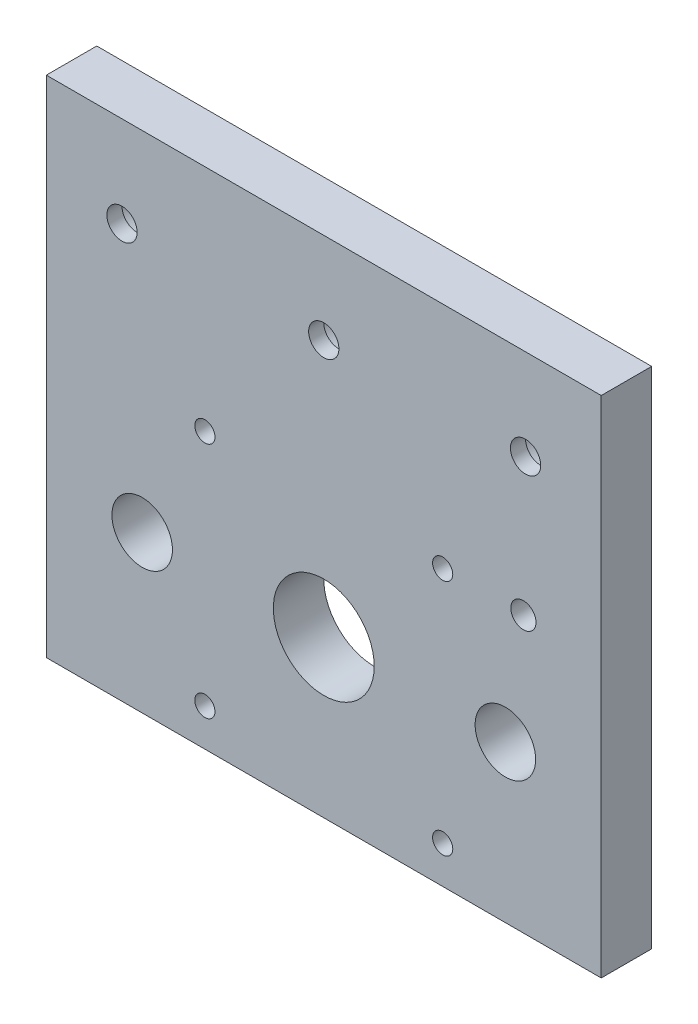
ISO-10303-21;
HEADER;
FILE_DESCRIPTION(('STEP AP214'),'2;1');
FILE_NAME('part.step','',(''),(''),'','','');
FILE_SCHEMA(('AUTOMOTIVE_DESIGN { 1 0 10303 214 1 1 1 1 }'));
ENDSEC;
DATA;
#1=APPLICATION_CONTEXT('core data for automotive mechanical design processes');
#2=APPLICATION_PROTOCOL_DEFINITION('international standard','automotive_design',2000,#1);
#3=PRODUCT_CONTEXT('',#1,'mechanical');
#4=PRODUCT('Part','Part','',(#3));
#5=PRODUCT_RELATED_PRODUCT_CATEGORY('part','',(#4));
#6=PRODUCT_DEFINITION_FORMATION('','',#4);
#7=PRODUCT_DEFINITION_CONTEXT('part definition',#1,'design');
#8=PRODUCT_DEFINITION('design','',#6,#7);
#9=PRODUCT_DEFINITION_SHAPE('','',#8);
#10=(LENGTH_UNIT() NAMED_UNIT(*) SI_UNIT(.MILLI.,.METRE.));
#11=(NAMED_UNIT(*) PLANE_ANGLE_UNIT() SI_UNIT($,.RADIAN.));
#12=(NAMED_UNIT(*) SI_UNIT($,.STERADIAN.) SOLID_ANGLE_UNIT());
#13=UNCERTAINTY_MEASURE_WITH_UNIT(LENGTH_MEASURE(1.E-05),#10,'distance_accuracy_value','');
#14=(GEOMETRIC_REPRESENTATION_CONTEXT(3) GLOBAL_UNCERTAINTY_ASSIGNED_CONTEXT((#13)) GLOBAL_UNIT_ASSIGNED_CONTEXT((#10,
#11,#12)) REPRESENTATION_CONTEXT('',''));
#15=CARTESIAN_POINT('',(0.,0.,0.));
#16=DIRECTION('',(0.,0.,1.));
#17=DIRECTION('',(1.,0.,0.));
#18=AXIS2_PLACEMENT_3D('',#15,#16,#17);
#19=CARTESIAN_POINT('',(0.,32.,9.99999999999976));
#20=DIRECTION('',(0.,0.,-1.));
#21=DIRECTION('',(-1.,0.,0.));
#22=AXIS2_PLACEMENT_3D('',#19,#20,#21);
#23=CYLINDRICAL_SURFACE('',#22,3.);
#24=CARTESIAN_POINT('',(0.,32.,9.99999999999976));
#25=DIRECTION('',(0.,0.,1.));
#26=DIRECTION('',(1.,0.,0.));
#27=AXIS2_PLACEMENT_3D('',#24,#25,#26);
#28=CIRCLE('',#27,3.);
#29=CARTESIAN_POINT('',(2.99999999999992,32.,9.99999999999975));
#30=VERTEX_POINT('',#29);
#31=EDGE_CURVE('E144',#30,#30,#28,.T.);
#32=ORIENTED_EDGE('',*,*,#31,.T.);
#33=EDGE_LOOP('',(#32));
#34=FACE_BOUND('',#33,.T.);
#35=CARTESIAN_POINT('',(0.,32.,6.99999999999976));
#36=DIRECTION('',(0.,0.,-1.));
#37=DIRECTION('',(-1.,0.,0.));
#38=AXIS2_PLACEMENT_3D('',#35,#36,#37);
#39=CIRCLE('',#38,3.);
#40=CARTESIAN_POINT('',(-3.00000000000006,32.,6.99999999999977));
#41=VERTEX_POINT('',#40);
#42=EDGE_CURVE('E21',#41,#41,#39,.T.);
#43=ORIENTED_EDGE('',*,*,#42,.T.);
#44=EDGE_LOOP('',(#43));
#45=FACE_BOUND('',#44,.T.);
#46=ADVANCED_FACE('F17',(#34,#45),#23,.F.);
#47=CARTESIAN_POINT('',(40.,32.,9.99999999999963));
#48=DIRECTION('',(0.,0.,-1.));
#49=DIRECTION('',(-1.,0.,0.));
#50=AXIS2_PLACEMENT_3D('',#47,#48,#49);
#51=CYLINDRICAL_SURFACE('',#50,3.);
#52=CARTESIAN_POINT('',(40.,32.,9.99999999999963));
#53=DIRECTION('',(0.,0.,1.));
#54=DIRECTION('',(1.,0.,0.));
#55=AXIS2_PLACEMENT_3D('',#52,#53,#54);
#56=CIRCLE('',#55,3.);
#57=CARTESIAN_POINT('',(43.,32.,9.99999999999962));
#58=VERTEX_POINT('',#57);
#59=EDGE_CURVE('E141',#58,#58,#56,.T.);
#60=ORIENTED_EDGE('',*,*,#59,.T.);
#61=EDGE_LOOP('',(#60));
#62=FACE_BOUND('',#61,.T.);
#63=CARTESIAN_POINT('',(40.,32.,6.99999999999963));
#64=DIRECTION('',(0.,0.,-1.));
#65=DIRECTION('',(-1.,0.,0.));
#66=AXIS2_PLACEMENT_3D('',#63,#64,#65);
#67=CIRCLE('',#66,3.);
#68=CARTESIAN_POINT('',(37.,32.,6.99999999999964));
#69=VERTEX_POINT('',#68);
#70=EDGE_CURVE('E96',#69,#69,#67,.T.);
#71=ORIENTED_EDGE('',*,*,#70,.T.);
#72=EDGE_LOOP('',(#71));
#73=FACE_BOUND('',#72,.T.);
#74=ADVANCED_FACE('F186',(#62,#73),#51,.F.);
#75=CARTESIAN_POINT('',(-40.,32.,9.99999999999977));
#76=DIRECTION('',(0.,0.,-1.));
#77=DIRECTION('',(-1.,0.,0.));
#78=AXIS2_PLACEMENT_3D('',#75,#76,#77);
#79=CYLINDRICAL_SURFACE('',#78,3.);
#80=CARTESIAN_POINT('',(-40.,32.,9.99999999999977));
#81=DIRECTION('',(0.,0.,1.));
#82=DIRECTION('',(1.,0.,0.));
#83=AXIS2_PLACEMENT_3D('',#80,#81,#82);
#84=CIRCLE('',#83,3.);
#85=CARTESIAN_POINT('',(-37.,32.,9.99999999999976));
#86=VERTEX_POINT('',#85);
#87=EDGE_CURVE('E136',#86,#86,#84,.T.);
#88=ORIENTED_EDGE('',*,*,#87,.T.);
#89=EDGE_LOOP('',(#88));
#90=FACE_BOUND('',#89,.T.);
#91=CARTESIAN_POINT('',(-40.,32.,6.99999999999977));
#92=DIRECTION('',(0.,0.,-1.));
#93=DIRECTION('',(-1.,0.,0.));
#94=AXIS2_PLACEMENT_3D('',#91,#92,#93);
#95=CIRCLE('',#94,3.);
#96=CARTESIAN_POINT('',(-43.,32.,6.99999999999978));
#97=VERTEX_POINT('',#96);
#98=EDGE_CURVE('E94',#97,#97,#95,.T.);
#99=ORIENTED_EDGE('',*,*,#98,.T.);
#100=EDGE_LOOP('',(#99));
#101=FACE_BOUND('',#100,.T.);
#102=ADVANCED_FACE('F193',(#90,#101),#79,.F.);
#103=CARTESIAN_POINT('',(0.,0.,9.99999999999976));
#104=DIRECTION('',(0.,0.,-1.));
#105=DIRECTION('',(-1.,0.,0.));
#106=AXIS2_PLACEMENT_3D('',#103,#104,#105);
#107=PLANE('',#106);
#108=DIRECTION('',(0.,-1.,0.));
#109=VECTOR('',#108,1.);
#110=CARTESIAN_POINT('',(-55.,50.,9.99999999999977));
#111=LINE('',#110,#109);
#112=CARTESIAN_POINT('',(-55.,50.,9.99999999999977));
#113=VERTEX_POINT('',#112);
#114=CARTESIAN_POINT('',(-55.,-50.,10.0000000000002));
#115=VERTEX_POINT('',#114);
#116=EDGE_CURVE('E72',#113,#115,#111,.T.);
#117=ORIENTED_EDGE('',*,*,#116,.T.);
#118=DIRECTION('',(1.,0.,0.));
#119=VECTOR('',#118,1.);
#120=CARTESIAN_POINT('',(55.,-50.,10.));
#121=LINE('',#120,#119);
#122=CARTESIAN_POINT('',(55.,-50.,10.));
#123=VERTEX_POINT('',#122);
#124=EDGE_CURVE('E66',#115,#123,#121,.T.);
#125=ORIENTED_EDGE('',*,*,#124,.T.);
#126=DIRECTION('',(0.,1.,0.));
#127=VECTOR('',#126,1.);
#128=CARTESIAN_POINT('',(55.,50.,9.99999999999961));
#129=LINE('',#128,#127);
#130=CARTESIAN_POINT('',(55.,50.,9.99999999999961));
#131=VERTEX_POINT('',#130);
#132=EDGE_CURVE('E70',#123,#131,#129,.T.);
#133=ORIENTED_EDGE('',*,*,#132,.T.);
#134=DIRECTION('',(-1.,0.,0.));
#135=VECTOR('',#134,1.);
#136=CARTESIAN_POINT('',(55.,50.,9.99999999999961));
#137=LINE('',#136,#135);
#138=EDGE_CURVE('E36',#131,#113,#137,.T.);
#139=ORIENTED_EDGE('',*,*,#138,.T.);
#140=EDGE_LOOP('',(#117,#125,#133,#139));
#141=FACE_BOUND('',#140,.T.);
#142=CARTESIAN_POINT('',(36.,-19.,10.));
#143=DIRECTION('',(0.,0.,1.));
#144=DIRECTION('',(1.,0.,0.));
#145=AXIS2_PLACEMENT_3D('',#142,#143,#144);
#146=CIRCLE('',#145,6.);
#147=CARTESIAN_POINT('',(42.,-19.,9.99999999999999));
#148=VERTEX_POINT('',#147);
#149=EDGE_CURVE('E88',#148,#148,#146,.T.);
#150=ORIENTED_EDGE('',*,*,#149,.F.);
#151=EDGE_LOOP('',(#150));
#152=FACE_BOUND('',#151,.T.);
#153=CARTESIAN_POINT('',(0.,-19.,9.99999999999976));
#154=DIRECTION('',(0.,0.,1.));
#155=DIRECTION('',(1.,0.,0.));
#156=AXIS2_PLACEMENT_3D('',#153,#154,#155);
#157=CIRCLE('',#156,10.);
#158=CARTESIAN_POINT('',(10.,-19.,9.99999999999974));
#159=VERTEX_POINT('',#158);
#160=EDGE_CURVE('E154',#159,#159,#157,.T.);
#161=ORIENTED_EDGE('',*,*,#160,.F.);
#162=EDGE_LOOP('',(#161));
#163=FACE_BOUND('',#162,.T.);
#164=CARTESIAN_POINT('',(-36.,-19.,9.99999999999977));
#165=DIRECTION('',(0.,0.,1.));
#166=DIRECTION('',(1.,0.,0.));
#167=AXIS2_PLACEMENT_3D('',#164,#165,#166);
#168=CIRCLE('',#167,6.);
#169=CARTESIAN_POINT('',(-30.,-19.,9.99999999999976));
#170=VERTEX_POINT('',#169);
#171=EDGE_CURVE('E148',#170,#170,#168,.T.);
#172=ORIENTED_EDGE('',*,*,#171,.F.);
#173=EDGE_LOOP('',(#172));
#174=FACE_BOUND('',#173,.T.);
#175=ORIENTED_EDGE('',*,*,#31,.F.);
#176=EDGE_LOOP('',(#175));
#177=FACE_BOUND('',#176,.T.);
#178=ORIENTED_EDGE('',*,*,#59,.F.);
#179=EDGE_LOOP('',(#178));
#180=FACE_BOUND('',#179,.T.);
#181=ORIENTED_EDGE('',*,*,#87,.F.);
#182=EDGE_LOOP('',(#181));
#183=FACE_BOUND('',#182,.T.);
#184=CARTESIAN_POINT('',(23.57,4.57,10.));
#185=DIRECTION('',(0.,0.,1.));
#186=DIRECTION('',(1.,0.,0.));
#187=AXIS2_PLACEMENT_3D('',#184,#185,#186);
#188=CIRCLE('',#187,2.);
#189=CARTESIAN_POINT('',(25.57,4.57,10.));
#190=VERTEX_POINT('',#189);
#191=EDGE_CURVE('E133',#190,#190,#188,.T.);
#192=ORIENTED_EDGE('',*,*,#191,.F.);
#193=EDGE_LOOP('',(#192));
#194=FACE_BOUND('',#193,.T.);
#195=CARTESIAN_POINT('',(-23.57,4.57,9.99999999999977));
#196=DIRECTION('',(0.,0.,1.));
#197=DIRECTION('',(1.,0.,0.));
#198=AXIS2_PLACEMENT_3D('',#195,#196,#197);
#199=CIRCLE('',#198,2.);
#200=CARTESIAN_POINT('',(-21.57,4.57,9.99999999999977));
#201=VERTEX_POINT('',#200);
#202=EDGE_CURVE('E127',#201,#201,#199,.T.);
#203=ORIENTED_EDGE('',*,*,#202,.F.);
#204=EDGE_LOOP('',(#203));
#205=FACE_BOUND('',#204,.T.);
#206=CARTESIAN_POINT('',(-23.57,-42.57,9.99999999999977));
#207=DIRECTION('',(0.,0.,1.));
#208=DIRECTION('',(1.,0.,0.));
#209=AXIS2_PLACEMENT_3D('',#206,#207,#208);
#210=CIRCLE('',#209,2.);
#211=CARTESIAN_POINT('',(-21.57,-42.57,9.99999999999977));
#212=VERTEX_POINT('',#211);
#213=EDGE_CURVE('E121',#212,#212,#210,.T.);
#214=ORIENTED_EDGE('',*,*,#213,.F.);
#215=EDGE_LOOP('',(#214));
#216=FACE_BOUND('',#215,.T.);
#217=CARTESIAN_POINT('',(23.57,-42.57,10.));
#218=DIRECTION('',(0.,0.,1.));
#219=DIRECTION('',(1.,0.,0.));
#220=AXIS2_PLACEMENT_3D('',#217,#218,#219);
#221=CIRCLE('',#220,2.);
#222=CARTESIAN_POINT('',(25.57,-42.57,10.));
#223=VERTEX_POINT('',#222);
#224=EDGE_CURVE('E115',#223,#223,#221,.T.);
#225=ORIENTED_EDGE('',*,*,#224,.F.);
#226=EDGE_LOOP('',(#225));
#227=FACE_BOUND('',#226,.T.);
#228=CARTESIAN_POINT('',(39.57,4.57,10.));
#229=DIRECTION('',(0.,0.,1.));
#230=DIRECTION('',(1.,0.,0.));
#231=AXIS2_PLACEMENT_3D('',#228,#229,#230);
#232=CIRCLE('',#231,2.5);
#233=CARTESIAN_POINT('',(42.07,4.57,9.99999999999999));
#234=VERTEX_POINT('',#233);
#235=EDGE_CURVE('E106',#234,#234,#232,.T.);
#236=ORIENTED_EDGE('',*,*,#235,.F.);
#237=EDGE_LOOP('',(#236));
#238=FACE_BOUND('',#237,.T.);
#239=ADVANCED_FACE('F67',(#141,#152,#163,#174,#177,#180,#183,#194,#205,#216,#227,#238),#107,.F.);
#240=CARTESIAN_POINT('',(0.,0.,0.));
#241=DIRECTION('',(0.,0.,-1.));
#242=DIRECTION('',(-1.,0.,0.));
#243=AXIS2_PLACEMENT_3D('',#240,#241,#242);
#244=PLANE('',#243);
#245=CARTESIAN_POINT('',(40.,32.,0.));
#246=DIRECTION('',(0.,0.,-1.));
#247=DIRECTION('',(-1.,0.,0.));
#248=AXIS2_PLACEMENT_3D('',#245,#246,#247);
#249=CIRCLE('',#248,5.5);
#250=CARTESIAN_POINT('',(34.5,32.,0.));
#251=VERTEX_POINT('',#250);
#252=EDGE_CURVE('E265',#251,#251,#249,.T.);
#253=ORIENTED_EDGE('',*,*,#252,.F.);
#254=EDGE_LOOP('',(#253));
#255=FACE_BOUND('',#254,.T.);
#256=CARTESIAN_POINT('',(0.,32.,0.));
#257=DIRECTION('',(0.,0.,-1.));
#258=DIRECTION('',(-1.,0.,0.));
#259=AXIS2_PLACEMENT_3D('',#256,#257,#258);
#260=CIRCLE('',#259,5.5);
#261=CARTESIAN_POINT('',(-5.50000000000006,32.,0.));
#262=VERTEX_POINT('',#261);
#263=EDGE_CURVE('E255',#262,#262,#260,.T.);
#264=ORIENTED_EDGE('',*,*,#263,.F.);
#265=EDGE_LOOP('',(#264));
#266=FACE_BOUND('',#265,.T.);
#267=CARTESIAN_POINT('',(-40.,32.,0.));
#268=DIRECTION('',(0.,0.,-1.));
#269=DIRECTION('',(-1.,0.,0.));
#270=AXIS2_PLACEMENT_3D('',#267,#268,#269);
#271=CIRCLE('',#270,5.5);
#272=CARTESIAN_POINT('',(-45.5,32.,0.));
#273=VERTEX_POINT('',#272);
#274=EDGE_CURVE('E256',#273,#273,#271,.T.);
#275=ORIENTED_EDGE('',*,*,#274,.F.);
#276=EDGE_LOOP('',(#275));
#277=FACE_BOUND('',#276,.T.);
#278=CARTESIAN_POINT('',(23.57,-42.57,0.));
#279=DIRECTION('',(0.,0.,1.));
#280=DIRECTION('',(1.,0.,0.));
#281=AXIS2_PLACEMENT_3D('',#278,#279,#280);
#282=CIRCLE('',#281,2.);
#283=CARTESIAN_POINT('',(25.57,-42.57,0.));
#284=VERTEX_POINT('',#283);
#285=EDGE_CURVE('E111',#284,#284,#282,.T.);
#286=ORIENTED_EDGE('',*,*,#285,.T.);
#287=EDGE_LOOP('',(#286));
#288=FACE_BOUND('',#287,.T.);
#289=CARTESIAN_POINT('',(-23.57,4.5700000000003,0.));
#290=DIRECTION('',(0.,0.,1.));
#291=DIRECTION('',(1.,0.,0.));
#292=AXIS2_PLACEMENT_3D('',#289,#290,#291);
#293=CIRCLE('',#292,2.);
#294=CARTESIAN_POINT('',(-21.57,4.5700000000003,0.));
#295=VERTEX_POINT('',#294);
#296=EDGE_CURVE('E124',#295,#295,#293,.T.);
#297=ORIENTED_EDGE('',*,*,#296,.T.);
#298=EDGE_LOOP('',(#297));
#299=FACE_BOUND('',#298,.T.);
#300=CARTESIAN_POINT('',(0.,-19.,0.));
#301=DIRECTION('',(0.,0.,1.));
#302=DIRECTION('',(1.,0.,0.));
#303=AXIS2_PLACEMENT_3D('',#300,#301,#302);
#304=CIRCLE('',#303,10.);
#305=CARTESIAN_POINT('',(10.,-19.,0.));
#306=VERTEX_POINT('',#305);
#307=EDGE_CURVE('E151',#306,#306,#304,.T.);
#308=ORIENTED_EDGE('',*,*,#307,.T.);
#309=EDGE_LOOP('',(#308));
#310=FACE_BOUND('',#309,.T.);
#311=DIRECTION('',(0.,-1.,0.));
#312=VECTOR('',#311,1.);
#313=CARTESIAN_POINT('',(-55.,50.,0.));
#314=LINE('',#313,#312);
#315=CARTESIAN_POINT('',(-55.,50.,0.));
#316=VERTEX_POINT('',#315);
#317=CARTESIAN_POINT('',(-55.,-50.,0.));
#318=VERTEX_POINT('',#317);
#319=EDGE_CURVE('E85',#316,#318,#314,.T.);
#320=ORIENTED_EDGE('',*,*,#319,.F.);
#321=DIRECTION('',(-1.,0.,0.));
#322=VECTOR('',#321,1.);
#323=CARTESIAN_POINT('',(55.,50.,0.));
#324=LINE('',#323,#322);
#325=CARTESIAN_POINT('',(55.,50.,0.));
#326=VERTEX_POINT('',#325);
#327=EDGE_CURVE('E59',#326,#316,#324,.T.);
#328=ORIENTED_EDGE('',*,*,#327,.F.);
#329=DIRECTION('',(0.,1.,0.));
#330=VECTOR('',#329,1.);
#331=CARTESIAN_POINT('',(55.,50.,0.));
#332=LINE('',#331,#330);
#333=CARTESIAN_POINT('',(55.,-50.,0.));
#334=VERTEX_POINT('',#333);
#335=EDGE_CURVE('E53',#334,#326,#332,.T.);
#336=ORIENTED_EDGE('',*,*,#335,.F.);
#337=DIRECTION('',(1.,0.,0.));
#338=VECTOR('',#337,1.);
#339=CARTESIAN_POINT('',(55.,-50.,0.));
#340=LINE('',#339,#338);
#341=EDGE_CURVE('E76',#318,#334,#340,.T.);
#342=ORIENTED_EDGE('',*,*,#341,.F.);
#343=EDGE_LOOP('',(#320,#328,#336,#342));
#344=FACE_BOUND('',#343,.T.);
#345=CARTESIAN_POINT('',(36.,-19.,0.));
#346=DIRECTION('',(0.,0.,1.));
#347=DIRECTION('',(1.,0.,0.));
#348=AXIS2_PLACEMENT_3D('',#345,#346,#347);
#349=CIRCLE('',#348,6.);
#350=CARTESIAN_POINT('',(42.,-19.,0.));
#351=VERTEX_POINT('',#350);
#352=EDGE_CURVE('E157',#351,#351,#349,.T.);
#353=ORIENTED_EDGE('',*,*,#352,.T.);
#354=EDGE_LOOP('',(#353));
#355=FACE_BOUND('',#354,.T.);
#356=CARTESIAN_POINT('',(-36.,-19.,0.));
#357=DIRECTION('',(0.,0.,1.));
#358=DIRECTION('',(1.,0.,0.));
#359=AXIS2_PLACEMENT_3D('',#356,#357,#358);
#360=CIRCLE('',#359,6.);
#361=CARTESIAN_POINT('',(-30.,-19.,0.));
#362=VERTEX_POINT('',#361);
#363=EDGE_CURVE('E147',#362,#362,#360,.T.);
#364=ORIENTED_EDGE('',*,*,#363,.T.);
#365=EDGE_LOOP('',(#364));
#366=FACE_BOUND('',#365,.T.);
#367=CARTESIAN_POINT('',(23.57,4.57,0.));
#368=DIRECTION('',(0.,0.,1.));
#369=DIRECTION('',(1.,0.,0.));
#370=AXIS2_PLACEMENT_3D('',#367,#368,#369);
#371=CIRCLE('',#370,2.);
#372=CARTESIAN_POINT('',(25.57,4.57,0.));
#373=VERTEX_POINT('',#372);
#374=EDGE_CURVE('E130',#373,#373,#371,.T.);
#375=ORIENTED_EDGE('',*,*,#374,.T.);
#376=EDGE_LOOP('',(#375));
#377=FACE_BOUND('',#376,.T.);
#378=CARTESIAN_POINT('',(-23.57,-42.57,0.));
#379=DIRECTION('',(0.,0.,1.));
#380=DIRECTION('',(1.,0.,0.));
#381=AXIS2_PLACEMENT_3D('',#378,#379,#380);
#382=CIRCLE('',#381,2.);
#383=CARTESIAN_POINT('',(-21.57,-42.57,0.));
#384=VERTEX_POINT('',#383);
#385=EDGE_CURVE('E118',#384,#384,#382,.T.);
#386=ORIENTED_EDGE('',*,*,#385,.T.);
#387=EDGE_LOOP('',(#386));
#388=FACE_BOUND('',#387,.T.);
#389=CARTESIAN_POINT('',(39.57,4.57,0.));
#390=DIRECTION('',(0.,0.,1.));
#391=DIRECTION('',(1.,0.,0.));
#392=AXIS2_PLACEMENT_3D('',#389,#390,#391);
#393=CIRCLE('',#392,2.5);
#394=CARTESIAN_POINT('',(42.07,4.57,0.));
#395=VERTEX_POINT('',#394);
#396=EDGE_CURVE('E102',#395,#395,#393,.T.);
#397=ORIENTED_EDGE('',*,*,#396,.T.);
#398=EDGE_LOOP('',(#397));
#399=FACE_BOUND('',#398,.T.);
#400=ADVANCED_FACE('F165',(#255,#266,#277,#288,#299,#310,#344,#355,#366,#377,#388,#399),#244,.T.);
#401=CARTESIAN_POINT('',(-55.,50.,9.99999999999977));
#402=DIRECTION('',(1.,0.,0.));
#403=DIRECTION('',(0.,1.,0.));
#404=AXIS2_PLACEMENT_3D('',#401,#402,#403);
#405=PLANE('',#404);
#406=ORIENTED_EDGE('',*,*,#319,.T.);
#407=DIRECTION('',(0.,0.,-1.));
#408=VECTOR('',#407,1.);
#409=CARTESIAN_POINT('',(-55.,-50.,10.0000000000002));
#410=LINE('',#409,#408);
#411=EDGE_CURVE('E11',#115,#318,#410,.T.);
#412=ORIENTED_EDGE('',*,*,#411,.F.);
#413=ORIENTED_EDGE('',*,*,#116,.F.);
#414=DIRECTION('',(0.,0.,-1.));
#415=VECTOR('',#414,1.);
#416=CARTESIAN_POINT('',(-55.,50.,9.99999999999977));
#417=LINE('',#416,#415);
#418=EDGE_CURVE('E81',#113,#316,#417,.T.);
#419=ORIENTED_EDGE('',*,*,#418,.T.);
#420=EDGE_LOOP('',(#406,#412,#413,#419));
#421=FACE_BOUND('',#420,.T.);
#422=ADVANCED_FACE('F19',(#421),#405,.F.);
#423=CARTESIAN_POINT('',(55.,-50.,10.));
#424=DIRECTION('',(0.,1.,0.));
#425=DIRECTION('',(-1.,0.,0.));
#426=AXIS2_PLACEMENT_3D('',#423,#424,#425);
#427=PLANE('',#426);
#428=ORIENTED_EDGE('',*,*,#341,.T.);
#429=DIRECTION('',(0.,0.,-1.));
#430=VECTOR('',#429,1.);
#431=CARTESIAN_POINT('',(55.,-50.,10.));
#432=LINE('',#431,#430);
#433=EDGE_CURVE('E27',#123,#334,#432,.T.);
#434=ORIENTED_EDGE('',*,*,#433,.F.);
#435=ORIENTED_EDGE('',*,*,#124,.F.);
#436=ORIENTED_EDGE('',*,*,#411,.T.);
#437=EDGE_LOOP('',(#428,#434,#435,#436));
#438=FACE_BOUND('',#437,.T.);
#439=ADVANCED_FACE('F75',(#438),#427,.F.);
#440=CARTESIAN_POINT('',(55.,50.,9.99999999999961));
#441=DIRECTION('',(-1.,0.,0.));
#442=DIRECTION('',(0.,-1.,0.));
#443=AXIS2_PLACEMENT_3D('',#440,#441,#442);
#444=PLANE('',#443);
#445=ORIENTED_EDGE('',*,*,#335,.T.);
#446=DIRECTION('',(0.,0.,-1.));
#447=VECTOR('',#446,1.);
#448=CARTESIAN_POINT('',(55.,50.,9.99999999999961));
#449=LINE('',#448,#447);
#450=EDGE_CURVE('E77',#131,#326,#449,.T.);
#451=ORIENTED_EDGE('',*,*,#450,.F.);
#452=ORIENTED_EDGE('',*,*,#132,.F.);
#453=ORIENTED_EDGE('',*,*,#433,.T.);
#454=EDGE_LOOP('',(#445,#451,#452,#453));
#455=FACE_BOUND('',#454,.T.);
#456=ADVANCED_FACE('F79',(#455),#444,.F.);
#457=CARTESIAN_POINT('',(55.,50.,9.99999999999961));
#458=DIRECTION('',(0.,-1.,0.));
#459=DIRECTION('',(1.,0.,0.));
#460=AXIS2_PLACEMENT_3D('',#457,#458,#459);
#461=PLANE('',#460);
#462=ORIENTED_EDGE('',*,*,#327,.T.);
#463=ORIENTED_EDGE('',*,*,#418,.F.);
#464=ORIENTED_EDGE('',*,*,#138,.F.);
#465=ORIENTED_EDGE('',*,*,#450,.T.);
#466=EDGE_LOOP('',(#462,#463,#464,#465));
#467=FACE_BOUND('',#466,.T.);
#468=ADVANCED_FACE('F171',(#467),#461,.F.);
#469=CARTESIAN_POINT('',(36.,-19.,10.));
#470=DIRECTION('',(0.,0.,-1.));
#471=DIRECTION('',(-1.,0.,0.));
#472=AXIS2_PLACEMENT_3D('',#469,#470,#471);
#473=CYLINDRICAL_SURFACE('',#472,6.);
#474=ORIENTED_EDGE('',*,*,#149,.T.);
#475=EDGE_LOOP('',(#474));
#476=FACE_BOUND('',#475,.T.);
#477=ORIENTED_EDGE('',*,*,#352,.F.);
#478=EDGE_LOOP('',(#477));
#479=FACE_BOUND('',#478,.T.);
#480=ADVANCED_FACE('F168',(#476,#479),#473,.F.);
#481=CARTESIAN_POINT('',(0.,-19.,9.99999999999976));
#482=DIRECTION('',(0.,0.,-1.));
#483=DIRECTION('',(-1.,0.,0.));
#484=AXIS2_PLACEMENT_3D('',#481,#482,#483);
#485=CYLINDRICAL_SURFACE('',#484,10.);
#486=ORIENTED_EDGE('',*,*,#160,.T.);
#487=EDGE_LOOP('',(#486));
#488=FACE_BOUND('',#487,.T.);
#489=ORIENTED_EDGE('',*,*,#307,.F.);
#490=EDGE_LOOP('',(#489));
#491=FACE_BOUND('',#490,.T.);
#492=ADVANCED_FACE('F170',(#488,#491),#485,.F.);
#493=CARTESIAN_POINT('',(-36.,-19.,9.99999999999977));
#494=DIRECTION('',(0.,0.,-1.));
#495=DIRECTION('',(-1.,0.,0.));
#496=AXIS2_PLACEMENT_3D('',#493,#494,#495);
#497=CYLINDRICAL_SURFACE('',#496,6.);
#498=ORIENTED_EDGE('',*,*,#171,.T.);
#499=EDGE_LOOP('',(#498));
#500=FACE_BOUND('',#499,.T.);
#501=ORIENTED_EDGE('',*,*,#363,.F.);
#502=EDGE_LOOP('',(#501));
#503=FACE_BOUND('',#502,.T.);
#504=ADVANCED_FACE('F180',(#500,#503),#497,.F.);
#505=CARTESIAN_POINT('',(23.57,4.57,10.));
#506=DIRECTION('',(0.,0.,-1.));
#507=DIRECTION('',(-1.,0.,0.));
#508=AXIS2_PLACEMENT_3D('',#505,#506,#507);
#509=CYLINDRICAL_SURFACE('',#508,2.);
#510=ORIENTED_EDGE('',*,*,#191,.T.);
#511=EDGE_LOOP('',(#510));
#512=FACE_BOUND('',#511,.T.);
#513=ORIENTED_EDGE('',*,*,#374,.F.);
#514=EDGE_LOOP('',(#513));
#515=FACE_BOUND('',#514,.T.);
#516=ADVANCED_FACE('F199',(#512,#515),#509,.F.);
#517=CARTESIAN_POINT('',(-23.57,4.57,9.99999999999977));
#518=DIRECTION('',(0.,0.,-1.));
#519=DIRECTION('',(-1.,0.,0.));
#520=AXIS2_PLACEMENT_3D('',#517,#518,#519);
#521=CYLINDRICAL_SURFACE('',#520,2.);
#522=ORIENTED_EDGE('',*,*,#202,.T.);
#523=EDGE_LOOP('',(#522));
#524=FACE_BOUND('',#523,.T.);
#525=ORIENTED_EDGE('',*,*,#296,.F.);
#526=EDGE_LOOP('',(#525));
#527=FACE_BOUND('',#526,.T.);
#528=ADVANCED_FACE('F205',(#524,#527),#521,.F.);
#529=CARTESIAN_POINT('',(-23.57,-42.57,9.99999999999977));
#530=DIRECTION('',(0.,0.,-1.));
#531=DIRECTION('',(-1.,0.,0.));
#532=AXIS2_PLACEMENT_3D('',#529,#530,#531);
#533=CYLINDRICAL_SURFACE('',#532,2.);
#534=ORIENTED_EDGE('',*,*,#213,.T.);
#535=EDGE_LOOP('',(#534));
#536=FACE_BOUND('',#535,.T.);
#537=ORIENTED_EDGE('',*,*,#385,.F.);
#538=EDGE_LOOP('',(#537));
#539=FACE_BOUND('',#538,.T.);
#540=ADVANCED_FACE('F219',(#536,#539),#533,.F.);
#541=CARTESIAN_POINT('',(23.57,-42.57,10.));
#542=DIRECTION('',(0.,0.,-1.));
#543=DIRECTION('',(-1.,0.,0.));
#544=AXIS2_PLACEMENT_3D('',#541,#542,#543);
#545=CYLINDRICAL_SURFACE('',#544,2.);
#546=ORIENTED_EDGE('',*,*,#224,.T.);
#547=EDGE_LOOP('',(#546));
#548=FACE_BOUND('',#547,.T.);
#549=ORIENTED_EDGE('',*,*,#285,.F.);
#550=EDGE_LOOP('',(#549));
#551=FACE_BOUND('',#550,.T.);
#552=ADVANCED_FACE('F221',(#548,#551),#545,.F.);
#553=CARTESIAN_POINT('',(39.57,4.57,10.));
#554=DIRECTION('',(0.,0.,-1.));
#555=DIRECTION('',(-1.,0.,0.));
#556=AXIS2_PLACEMENT_3D('',#553,#554,#555);
#557=CYLINDRICAL_SURFACE('',#556,2.5);
#558=ORIENTED_EDGE('',*,*,#235,.T.);
#559=EDGE_LOOP('',(#558));
#560=FACE_BOUND('',#559,.T.);
#561=ORIENTED_EDGE('',*,*,#396,.F.);
#562=EDGE_LOOP('',(#561));
#563=FACE_BOUND('',#562,.T.);
#564=ADVANCED_FACE('F229',(#560,#563),#557,.F.);
#565=CARTESIAN_POINT('',(-40.,32.,6.99999999999977));
#566=DIRECTION('',(0.,0.,-1.));
#567=DIRECTION('',(-1.,0.,0.));
#568=AXIS2_PLACEMENT_3D('',#565,#566,#567);
#569=CYLINDRICAL_SURFACE('',#568,5.5);
#570=CARTESIAN_POINT('',(-40.,32.,6.99999999999977));
#571=DIRECTION('',(0.,0.,-1.));
#572=DIRECTION('',(-1.,0.,0.));
#573=AXIS2_PLACEMENT_3D('',#570,#571,#572);
#574=CIRCLE('',#573,5.5);
#575=CARTESIAN_POINT('',(-45.5,32.,6.99999999999978));
#576=VERTEX_POINT('',#575);
#577=EDGE_CURVE('E253',#576,#576,#574,.T.);
#578=ORIENTED_EDGE('',*,*,#577,.F.);
#579=EDGE_LOOP('',(#578));
#580=FACE_BOUND('',#579,.T.);
#581=ORIENTED_EDGE('',*,*,#274,.T.);
#582=EDGE_LOOP('',(#581));
#583=FACE_BOUND('',#582,.T.);
#584=ADVANCED_FACE('F249',(#580,#583),#569,.F.);
#585=CARTESIAN_POINT('',(-40.,32.,6.99999999999977));
#586=DIRECTION('',(0.,0.,-1.));
#587=DIRECTION('',(-1.,0.,0.));
#588=AXIS2_PLACEMENT_3D('',#585,#586,#587);
#589=PLANE('',#588);
#590=ORIENTED_EDGE('',*,*,#98,.F.);
#591=EDGE_LOOP('',(#590));
#592=FACE_BOUND('',#591,.T.);
#593=ORIENTED_EDGE('',*,*,#577,.T.);
#594=EDGE_LOOP('',(#593));
#595=FACE_BOUND('',#594,.T.);
#596=ADVANCED_FACE('F245',(#592,#595),#589,.T.);
#597=CARTESIAN_POINT('',(40.,32.,6.99999999999963));
#598=DIRECTION('',(0.,0.,-1.));
#599=DIRECTION('',(-1.,0.,0.));
#600=AXIS2_PLACEMENT_3D('',#597,#598,#599);
#601=CYLINDRICAL_SURFACE('',#600,5.5);
#602=CARTESIAN_POINT('',(40.,32.,6.99999999999963));
#603=DIRECTION('',(0.,0.,-1.));
#604=DIRECTION('',(-1.,0.,0.));
#605=AXIS2_PLACEMENT_3D('',#602,#603,#604);
#606=CIRCLE('',#605,5.5);
#607=CARTESIAN_POINT('',(34.5,32.,6.99999999999964));
#608=VERTEX_POINT('',#607);
#609=EDGE_CURVE('E97',#608,#608,#606,.T.);
#610=ORIENTED_EDGE('',*,*,#609,.F.);
#611=EDGE_LOOP('',(#610));
#612=FACE_BOUND('',#611,.T.);
#613=ORIENTED_EDGE('',*,*,#252,.T.);
#614=EDGE_LOOP('',(#613));
#615=FACE_BOUND('',#614,.T.);
#616=ADVANCED_FACE('F248',(#612,#615),#601,.F.);
#617=CARTESIAN_POINT('',(40.,32.,6.99999999999963));
#618=DIRECTION('',(0.,0.,-1.));
#619=DIRECTION('',(-1.,0.,0.));
#620=AXIS2_PLACEMENT_3D('',#617,#618,#619);
#621=PLANE('',#620);
#622=ORIENTED_EDGE('',*,*,#70,.F.);
#623=EDGE_LOOP('',(#622));
#624=FACE_BOUND('',#623,.T.);
#625=ORIENTED_EDGE('',*,*,#609,.T.);
#626=EDGE_LOOP('',(#625));
#627=FACE_BOUND('',#626,.T.);
#628=ADVANCED_FACE('F271',(#624,#627),#621,.T.);
#629=CARTESIAN_POINT('',(0.,32.,6.99999999999976));
#630=DIRECTION('',(0.,0.,-1.));
#631=DIRECTION('',(-1.,0.,0.));
#632=AXIS2_PLACEMENT_3D('',#629,#630,#631);
#633=CYLINDRICAL_SURFACE('',#632,5.5);
#634=CARTESIAN_POINT('',(0.,32.,6.99999999999976));
#635=DIRECTION('',(0.,0.,-1.));
#636=DIRECTION('',(-1.,0.,0.));
#637=AXIS2_PLACEMENT_3D('',#634,#635,#636);
#638=CIRCLE('',#637,5.5);
#639=CARTESIAN_POINT('',(-5.50000000000006,32.,6.99999999999977));
#640=VERTEX_POINT('',#639);
#641=EDGE_CURVE('E259',#640,#640,#638,.T.);
#642=ORIENTED_EDGE('',*,*,#641,.F.);
#643=EDGE_LOOP('',(#642));
#644=FACE_BOUND('',#643,.T.);
#645=ORIENTED_EDGE('',*,*,#263,.T.);
#646=EDGE_LOOP('',(#645));
#647=FACE_BOUND('',#646,.T.);
#648=ADVANCED_FACE('F400',(#644,#647),#633,.F.);
#649=CARTESIAN_POINT('',(0.,32.,6.99999999999976));
#650=DIRECTION('',(0.,0.,-1.));
#651=DIRECTION('',(-1.,0.,0.));
#652=AXIS2_PLACEMENT_3D('',#649,#650,#651);
#653=PLANE('',#652);
#654=ORIENTED_EDGE('',*,*,#42,.F.);
#655=EDGE_LOOP('',(#654));
#656=FACE_BOUND('',#655,.T.);
#657=ORIENTED_EDGE('',*,*,#641,.T.);
#658=EDGE_LOOP('',(#657));
#659=FACE_BOUND('',#658,.T.);
#660=ADVANCED_FACE('F409',(#656,#659),#653,.T.);
#661=CLOSED_SHELL('',(#46,#74,#102,#239,#400,#422,#439,#456,#468,#480,#492,#504,#516,#528,#540,
#552,#564,#584,#596,#616,#628,#648,#660));
#662=MANIFOLD_SOLID_BREP('B1',#661);
#663=ADVANCED_BREP_SHAPE_REPRESENTATION('',(#18,#662),#14);
#664=SHAPE_DEFINITION_REPRESENTATION(#9,#663);
ENDSEC;
END-ISO-10303-21;
